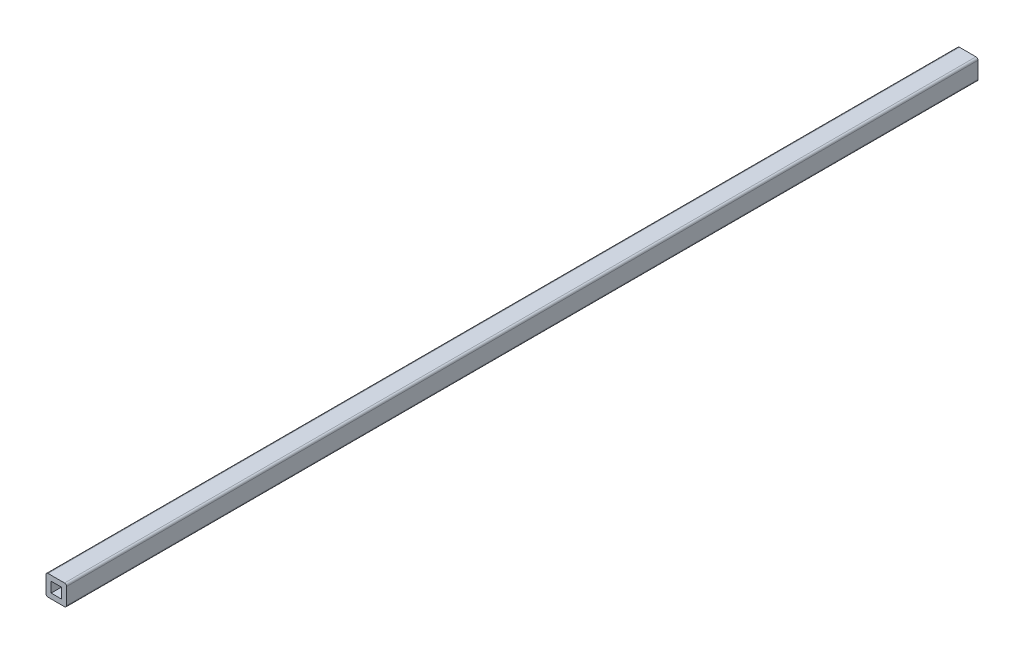
ISO-10303-21;
HEADER;
FILE_DESCRIPTION(('STEP AP214'),'2;1');
FILE_NAME('part.step','',(''),(''),'','','');
FILE_SCHEMA(('AUTOMOTIVE_DESIGN { 1 0 10303 214 1 1 1 1 }'));
ENDSEC;
DATA;
#1=APPLICATION_CONTEXT('core data for automotive mechanical design processes');
#2=APPLICATION_PROTOCOL_DEFINITION('international standard','automotive_design',2000,#1);
#3=PRODUCT_CONTEXT('',#1,'mechanical');
#4=PRODUCT('Part','Part','',(#3));
#5=PRODUCT_RELATED_PRODUCT_CATEGORY('part','',(#4));
#6=PRODUCT_DEFINITION_FORMATION('','',#4);
#7=PRODUCT_DEFINITION_CONTEXT('part definition',#1,'design');
#8=PRODUCT_DEFINITION('design','',#6,#7);
#9=PRODUCT_DEFINITION_SHAPE('','',#8);
#10=(LENGTH_UNIT() NAMED_UNIT(*) SI_UNIT(.MILLI.,.METRE.));
#11=(NAMED_UNIT(*) PLANE_ANGLE_UNIT() SI_UNIT($,.RADIAN.));
#12=(NAMED_UNIT(*) SI_UNIT($,.STERADIAN.) SOLID_ANGLE_UNIT());
#13=UNCERTAINTY_MEASURE_WITH_UNIT(LENGTH_MEASURE(1.E-05),#10,'distance_accuracy_value','');
#14=(GEOMETRIC_REPRESENTATION_CONTEXT(3) GLOBAL_UNCERTAINTY_ASSIGNED_CONTEXT((#13)) GLOBAL_UNIT_ASSIGNED_CONTEXT((#10,
#11,#12)) REPRESENTATION_CONTEXT('',''));
#15=CARTESIAN_POINT('',(0.,0.,0.));
#16=DIRECTION('',(0.,0.,1.));
#17=DIRECTION('',(1.,0.,0.));
#18=AXIS2_PLACEMENT_3D('',#15,#16,#17);
#19=CARTESIAN_POINT('',(0.,0.,2250.44));
#20=DIRECTION('',(0.,0.,1.));
#21=DIRECTION('',(1.,0.,0.));
#22=AXIS2_PLACEMENT_3D('',#19,#20,#21);
#23=PLANE('',#22);
#24=DIRECTION('',(1.,0.,0.));
#25=VECTOR('',#24,1.);
#26=CARTESIAN_POINT('',(-25.4,-25.4,2250.44));
#27=LINE('',#26,#25);
#28=CARTESIAN_POINT('',(-20.4,-25.4,2250.44));
#29=VERTEX_POINT('',#28);
#30=CARTESIAN_POINT('',(20.4,-25.4,2250.44));
#31=VERTEX_POINT('',#30);
#32=EDGE_CURVE('E173',#29,#31,#27,.T.);
#33=ORIENTED_EDGE('',*,*,#32,.T.);
#34=CARTESIAN_POINT('',(20.4,-20.4,2250.44));
#35=DIRECTION('',(0.,0.,1.));
#36=DIRECTION('',(1.,0.,0.));
#37=AXIS2_PLACEMENT_3D('',#34,#35,#36);
#38=CIRCLE('',#37,5.);
#39=CARTESIAN_POINT('',(25.4,-20.4,2250.44));
#40=VERTEX_POINT('',#39);
#41=EDGE_CURVE('E208',#31,#40,#38,.T.);
#42=ORIENTED_EDGE('',*,*,#41,.T.);
#43=DIRECTION('',(0.,1.,0.));
#44=VECTOR('',#43,1.);
#45=CARTESIAN_POINT('',(25.4,25.4,2250.44));
#46=LINE('',#45,#44);
#47=CARTESIAN_POINT('',(25.4,20.4,2250.44));
#48=VERTEX_POINT('',#47);
#49=EDGE_CURVE('E165',#40,#48,#46,.T.);
#50=ORIENTED_EDGE('',*,*,#49,.T.);
#51=CARTESIAN_POINT('',(20.4,20.4,2250.44));
#52=DIRECTION('',(0.,0.,1.));
#53=DIRECTION('',(1.,0.,0.));
#54=AXIS2_PLACEMENT_3D('',#51,#52,#53);
#55=CIRCLE('',#54,5.);
#56=CARTESIAN_POINT('',(20.4,25.4,2250.44));
#57=VERTEX_POINT('',#56);
#58=EDGE_CURVE('E203',#48,#57,#55,.T.);
#59=ORIENTED_EDGE('',*,*,#58,.T.);
#60=DIRECTION('',(-1.,0.,0.));
#61=VECTOR('',#60,1.);
#62=CARTESIAN_POINT('',(-25.4,25.4,2250.44));
#63=LINE('',#62,#61);
#64=CARTESIAN_POINT('',(-20.4,25.4,2250.44));
#65=VERTEX_POINT('',#64);
#66=EDGE_CURVE('E168',#57,#65,#63,.T.);
#67=ORIENTED_EDGE('',*,*,#66,.T.);
#68=CARTESIAN_POINT('',(-20.4,20.4,2250.44));
#69=DIRECTION('',(0.,0.,1.));
#70=DIRECTION('',(1.,0.,0.));
#71=AXIS2_PLACEMENT_3D('',#68,#69,#70);
#72=CIRCLE('',#71,5.);
#73=CARTESIAN_POINT('',(-25.4,20.4,2250.44));
#74=VERTEX_POINT('',#73);
#75=EDGE_CURVE('E55',#65,#74,#72,.T.);
#76=ORIENTED_EDGE('',*,*,#75,.T.);
#77=DIRECTION('',(0.,-1.,0.));
#78=VECTOR('',#77,1.);
#79=CARTESIAN_POINT('',(-25.4,25.4,2250.44));
#80=LINE('',#79,#78);
#81=CARTESIAN_POINT('',(-25.4,-20.4,2250.44));
#82=VERTEX_POINT('',#81);
#83=EDGE_CURVE('E171',#74,#82,#80,.T.);
#84=ORIENTED_EDGE('',*,*,#83,.T.);
#85=CARTESIAN_POINT('',(-20.4,-20.4,2250.44));
#86=DIRECTION('',(0.,0.,1.));
#87=DIRECTION('',(1.,0.,0.));
#88=AXIS2_PLACEMENT_3D('',#85,#86,#87);
#89=CIRCLE('',#88,5.);
#90=EDGE_CURVE('E206',#82,#29,#89,.T.);
#91=ORIENTED_EDGE('',*,*,#90,.T.);
#92=EDGE_LOOP('',(#33,#42,#50,#59,#67,#76,#84,#91));
#93=FACE_BOUND('',#92,.T.);
#94=DIRECTION('',(1.,0.,0.));
#95=VECTOR('',#94,1.);
#96=CARTESIAN_POINT('',(12.7,-12.7,2250.44));
#97=LINE('',#96,#95);
#98=CARTESIAN_POINT('',(-12.7,-12.7,2250.44));
#99=VERTEX_POINT('',#98);
#100=CARTESIAN_POINT('',(12.7,-12.7,2250.44));
#101=VERTEX_POINT('',#100);
#102=EDGE_CURVE('E134',#99,#101,#97,.T.);
#103=ORIENTED_EDGE('',*,*,#102,.F.);
#104=DIRECTION('',(0.,-1.,0.));
#105=VECTOR('',#104,1.);
#106=CARTESIAN_POINT('',(-12.7,-12.7,2250.44));
#107=LINE('',#106,#105);
#108=CARTESIAN_POINT('',(-12.7,12.7,2250.44));
#109=VERTEX_POINT('',#108);
#110=EDGE_CURVE('E124',#109,#99,#107,.T.);
#111=ORIENTED_EDGE('',*,*,#110,.F.);
#112=DIRECTION('',(-1.,0.,0.));
#113=VECTOR('',#112,1.);
#114=CARTESIAN_POINT('',(12.7,12.7,2250.44));
#115=LINE('',#114,#113);
#116=CARTESIAN_POINT('',(12.7,12.7,2250.44));
#117=VERTEX_POINT('',#116);
#118=EDGE_CURVE('E149',#117,#109,#115,.T.);
#119=ORIENTED_EDGE('',*,*,#118,.F.);
#120=DIRECTION('',(0.,1.,0.));
#121=VECTOR('',#120,1.);
#122=CARTESIAN_POINT('',(12.7,-12.7,2250.44));
#123=LINE('',#122,#121);
#124=EDGE_CURVE('E147',#101,#117,#123,.T.);
#125=ORIENTED_EDGE('',*,*,#124,.F.);
#126=EDGE_LOOP('',(#103,#111,#119,#125));
#127=FACE_BOUND('',#126,.T.);
#128=ADVANCED_FACE('F33',(#93,#127),#23,.T.);
#129=CARTESIAN_POINT('',(0.,0.,0.));
#130=DIRECTION('',(0.,0.,1.));
#131=DIRECTION('',(1.,0.,0.));
#132=AXIS2_PLACEMENT_3D('',#129,#130,#131);
#133=PLANE('',#132);
#134=DIRECTION('',(0.,1.,0.));
#135=VECTOR('',#134,1.);
#136=CARTESIAN_POINT('',(25.4,25.4,0.));
#137=LINE('',#136,#135);
#138=CARTESIAN_POINT('',(25.4,-20.4,0.));
#139=VERTEX_POINT('',#138);
#140=CARTESIAN_POINT('',(25.4,20.4,0.));
#141=VERTEX_POINT('',#140);
#142=EDGE_CURVE('E142',#139,#141,#137,.T.);
#143=ORIENTED_EDGE('',*,*,#142,.F.);
#144=CARTESIAN_POINT('',(20.4,-20.4,0.));
#145=DIRECTION('',(0.,0.,1.));
#146=DIRECTION('',(1.,0.,0.));
#147=AXIS2_PLACEMENT_3D('',#144,#145,#146);
#148=CIRCLE('',#147,5.);
#149=CARTESIAN_POINT('',(20.4,-25.4,0.));
#150=VERTEX_POINT('',#149);
#151=EDGE_CURVE('E196',#139,#150,#148,.F.);
#152=ORIENTED_EDGE('',*,*,#151,.T.);
#153=DIRECTION('',(1.,0.,0.));
#154=VECTOR('',#153,1.);
#155=CARTESIAN_POINT('',(-25.4,-25.4,0.));
#156=LINE('',#155,#154);
#157=CARTESIAN_POINT('',(-20.4,-25.4,0.));
#158=VERTEX_POINT('',#157);
#159=EDGE_CURVE('E169',#158,#150,#156,.T.);
#160=ORIENTED_EDGE('',*,*,#159,.F.);
#161=CARTESIAN_POINT('',(-20.4,-20.4,0.));
#162=DIRECTION('',(0.,0.,1.));
#163=DIRECTION('',(1.,0.,0.));
#164=AXIS2_PLACEMENT_3D('',#161,#162,#163);
#165=CIRCLE('',#164,5.);
#166=CARTESIAN_POINT('',(-25.4,-20.4,0.));
#167=VERTEX_POINT('',#166);
#168=EDGE_CURVE('E194',#158,#167,#165,.F.);
#169=ORIENTED_EDGE('',*,*,#168,.T.);
#170=DIRECTION('',(0.,-1.,0.));
#171=VECTOR('',#170,1.);
#172=CARTESIAN_POINT('',(-25.4,25.4,0.));
#173=LINE('',#172,#171);
#174=CARTESIAN_POINT('',(-25.4,20.4,0.));
#175=VERTEX_POINT('',#174);
#176=EDGE_CURVE('E182',#175,#167,#173,.T.);
#177=ORIENTED_EDGE('',*,*,#176,.F.);
#178=CARTESIAN_POINT('',(-20.4,20.4,0.));
#179=DIRECTION('',(0.,0.,1.));
#180=DIRECTION('',(1.,0.,0.));
#181=AXIS2_PLACEMENT_3D('',#178,#179,#180);
#182=CIRCLE('',#181,5.);
#183=CARTESIAN_POINT('',(-20.4,25.4,0.));
#184=VERTEX_POINT('',#183);
#185=EDGE_CURVE('E192',#175,#184,#182,.F.);
#186=ORIENTED_EDGE('',*,*,#185,.T.);
#187=DIRECTION('',(-1.,0.,0.));
#188=VECTOR('',#187,1.);
#189=CARTESIAN_POINT('',(-25.4,25.4,0.));
#190=LINE('',#189,#188);
#191=CARTESIAN_POINT('',(20.4,25.4,0.));
#192=VERTEX_POINT('',#191);
#193=EDGE_CURVE('E179',#192,#184,#190,.T.);
#194=ORIENTED_EDGE('',*,*,#193,.F.);
#195=CARTESIAN_POINT('',(20.4,20.4,0.));
#196=DIRECTION('',(0.,0.,1.));
#197=DIRECTION('',(1.,0.,0.));
#198=AXIS2_PLACEMENT_3D('',#195,#196,#197);
#199=CIRCLE('',#198,5.);
#200=EDGE_CURVE('E190',#192,#141,#199,.F.);
#201=ORIENTED_EDGE('',*,*,#200,.T.);
#202=EDGE_LOOP('',(#143,#152,#160,#169,#177,#186,#194,#201));
#203=FACE_BOUND('',#202,.T.);
#204=DIRECTION('',(0.,-1.,0.));
#205=VECTOR('',#204,1.);
#206=CARTESIAN_POINT('',(-12.7,-12.7,0.));
#207=LINE('',#206,#205);
#208=CARTESIAN_POINT('',(-12.7,12.7,0.));
#209=VERTEX_POINT('',#208);
#210=CARTESIAN_POINT('',(-12.7,-12.7,0.));
#211=VERTEX_POINT('',#210);
#212=EDGE_CURVE('E153',#209,#211,#207,.T.);
#213=ORIENTED_EDGE('',*,*,#212,.T.);
#214=DIRECTION('',(1.,0.,0.));
#215=VECTOR('',#214,1.);
#216=CARTESIAN_POINT('',(12.7,-12.7,0.));
#217=LINE('',#216,#215);
#218=CARTESIAN_POINT('',(12.7,-12.7,0.));
#219=VERTEX_POINT('',#218);
#220=EDGE_CURVE('E141',#211,#219,#217,.T.);
#221=ORIENTED_EDGE('',*,*,#220,.T.);
#222=DIRECTION('',(0.,1.,0.));
#223=VECTOR('',#222,1.);
#224=CARTESIAN_POINT('',(12.7,-12.7,0.));
#225=LINE('',#224,#223);
#226=CARTESIAN_POINT('',(12.7,12.7,0.));
#227=VERTEX_POINT('',#226);
#228=EDGE_CURVE('E156',#219,#227,#225,.T.);
#229=ORIENTED_EDGE('',*,*,#228,.T.);
#230=DIRECTION('',(-1.,0.,0.));
#231=VECTOR('',#230,1.);
#232=CARTESIAN_POINT('',(12.7,12.7,0.));
#233=LINE('',#232,#231);
#234=EDGE_CURVE('E135',#227,#209,#233,.T.);
#235=ORIENTED_EDGE('',*,*,#234,.T.);
#236=EDGE_LOOP('',(#213,#221,#229,#235));
#237=FACE_BOUND('',#236,.T.);
#238=ADVANCED_FACE('F224',(#203,#237),#133,.F.);
#239=CARTESIAN_POINT('',(25.4,25.4,2250.44));
#240=DIRECTION('',(-1.,0.,0.));
#241=DIRECTION('',(0.,-1.,0.));
#242=AXIS2_PLACEMENT_3D('',#239,#240,#241);
#243=PLANE('',#242);
#244=ORIENTED_EDGE('',*,*,#49,.F.);
#245=DIRECTION('',(0.,0.,-1.));
#246=VECTOR('',#245,1.);
#247=CARTESIAN_POINT('',(25.4,-20.4,2250.44));
#248=LINE('',#247,#246);
#249=EDGE_CURVE('E187',#40,#139,#248,.T.);
#250=ORIENTED_EDGE('',*,*,#249,.T.);
#251=ORIENTED_EDGE('',*,*,#142,.T.);
#252=DIRECTION('',(0.,0.,-1.));
#253=VECTOR('',#252,1.);
#254=CARTESIAN_POINT('',(25.4,20.4,2250.44));
#255=LINE('',#254,#253);
#256=EDGE_CURVE('E176',#141,#48,#255,.F.);
#257=ORIENTED_EDGE('',*,*,#256,.T.);
#258=EDGE_LOOP('',(#244,#250,#251,#257));
#259=FACE_BOUND('',#258,.T.);
#260=ADVANCED_FACE('F246',(#259),#243,.F.);
#261=CARTESIAN_POINT('',(-25.4,25.4,2250.44));
#262=DIRECTION('',(0.,-1.,0.));
#263=DIRECTION('',(1.,0.,0.));
#264=AXIS2_PLACEMENT_3D('',#261,#262,#263);
#265=PLANE('',#264);
#266=ORIENTED_EDGE('',*,*,#193,.T.);
#267=DIRECTION('',(0.,0.,-1.));
#268=VECTOR('',#267,1.);
#269=CARTESIAN_POINT('',(-20.4,25.4,2250.44));
#270=LINE('',#269,#268);
#271=EDGE_CURVE('E11',#184,#65,#270,.F.);
#272=ORIENTED_EDGE('',*,*,#271,.T.);
#273=ORIENTED_EDGE('',*,*,#66,.F.);
#274=DIRECTION('',(0.,0.,-1.));
#275=VECTOR('',#274,1.);
#276=CARTESIAN_POINT('',(20.4,25.4,2250.44));
#277=LINE('',#276,#275);
#278=EDGE_CURVE('E41',#57,#192,#277,.T.);
#279=ORIENTED_EDGE('',*,*,#278,.T.);
#280=EDGE_LOOP('',(#266,#272,#273,#279));
#281=FACE_BOUND('',#280,.T.);
#282=ADVANCED_FACE('F218',(#281),#265,.F.);
#283=CARTESIAN_POINT('',(-25.4,25.4,2250.44));
#284=DIRECTION('',(1.,0.,0.));
#285=DIRECTION('',(0.,0.,-1.));
#286=AXIS2_PLACEMENT_3D('',#283,#284,#285);
#287=PLANE('',#286);
#288=ORIENTED_EDGE('',*,*,#176,.T.);
#289=DIRECTION('',(0.,0.,-1.));
#290=VECTOR('',#289,1.);
#291=CARTESIAN_POINT('',(-25.4,-20.4,2250.44));
#292=LINE('',#291,#290);
#293=EDGE_CURVE('E48',#167,#82,#292,.F.);
#294=ORIENTED_EDGE('',*,*,#293,.T.);
#295=ORIENTED_EDGE('',*,*,#83,.F.);
#296=DIRECTION('',(0.,0.,-1.));
#297=VECTOR('',#296,1.);
#298=CARTESIAN_POINT('',(-25.4,20.4,2250.44));
#299=LINE('',#298,#297);
#300=EDGE_CURVE('E210',#74,#175,#299,.T.);
#301=ORIENTED_EDGE('',*,*,#300,.T.);
#302=EDGE_LOOP('',(#288,#294,#295,#301));
#303=FACE_BOUND('',#302,.T.);
#304=ADVANCED_FACE('F230',(#303),#287,.F.);
#305=CARTESIAN_POINT('',(-25.4,-25.4,2250.44));
#306=DIRECTION('',(0.,1.,0.));
#307=DIRECTION('',(0.,0.,1.));
#308=AXIS2_PLACEMENT_3D('',#305,#306,#307);
#309=PLANE('',#308);
#310=ORIENTED_EDGE('',*,*,#159,.T.);
#311=DIRECTION('',(0.,0.,-1.));
#312=VECTOR('',#311,1.);
#313=CARTESIAN_POINT('',(20.4,-25.4,2250.44));
#314=LINE('',#313,#312);
#315=EDGE_CURVE('E201',#150,#31,#314,.F.);
#316=ORIENTED_EDGE('',*,*,#315,.T.);
#317=ORIENTED_EDGE('',*,*,#32,.F.);
#318=DIRECTION('',(0.,0.,-1.));
#319=VECTOR('',#318,1.);
#320=CARTESIAN_POINT('',(-20.4,-25.4,2250.44));
#321=LINE('',#320,#319);
#322=EDGE_CURVE('E198',#29,#158,#321,.T.);
#323=ORIENTED_EDGE('',*,*,#322,.T.);
#324=EDGE_LOOP('',(#310,#316,#317,#323));
#325=FACE_BOUND('',#324,.T.);
#326=ADVANCED_FACE('F238',(#325),#309,.F.);
#327=CARTESIAN_POINT('',(-12.7,-12.7,2250.44));
#328=DIRECTION('',(1.,0.,0.));
#329=DIRECTION('',(0.,0.,-1.));
#330=AXIS2_PLACEMENT_3D('',#327,#328,#329);
#331=PLANE('',#330);
#332=ORIENTED_EDGE('',*,*,#212,.F.);
#333=DIRECTION('',(0.,0.,-1.));
#334=VECTOR('',#333,1.);
#335=CARTESIAN_POINT('',(-12.7,12.7,2250.44));
#336=LINE('',#335,#334);
#337=EDGE_CURVE('E130',#109,#209,#336,.T.);
#338=ORIENTED_EDGE('',*,*,#337,.F.);
#339=ORIENTED_EDGE('',*,*,#110,.T.);
#340=DIRECTION('',(0.,0.,-1.));
#341=VECTOR('',#340,1.);
#342=CARTESIAN_POINT('',(-12.7,-12.7,2250.44));
#343=LINE('',#342,#341);
#344=EDGE_CURVE('E127',#99,#211,#343,.T.);
#345=ORIENTED_EDGE('',*,*,#344,.T.);
#346=EDGE_LOOP('',(#332,#338,#339,#345));
#347=FACE_BOUND('',#346,.T.);
#348=ADVANCED_FACE('F126',(#347),#331,.T.);
#349=CARTESIAN_POINT('',(12.7,-12.7,2250.44));
#350=DIRECTION('',(0.,1.,0.));
#351=DIRECTION('',(0.,0.,1.));
#352=AXIS2_PLACEMENT_3D('',#349,#350,#351);
#353=PLANE('',#352);
#354=ORIENTED_EDGE('',*,*,#220,.F.);
#355=ORIENTED_EDGE('',*,*,#344,.F.);
#356=ORIENTED_EDGE('',*,*,#102,.T.);
#357=DIRECTION('',(0.,0.,-1.));
#358=VECTOR('',#357,1.);
#359=CARTESIAN_POINT('',(12.7,-12.7,2250.44));
#360=LINE('',#359,#358);
#361=EDGE_CURVE('E143',#101,#219,#360,.T.);
#362=ORIENTED_EDGE('',*,*,#361,.T.);
#363=EDGE_LOOP('',(#354,#355,#356,#362));
#364=FACE_BOUND('',#363,.T.);
#365=ADVANCED_FACE('F138',(#364),#353,.T.);
#366=CARTESIAN_POINT('',(12.7,-12.7,2250.44));
#367=DIRECTION('',(-1.,0.,0.));
#368=DIRECTION('',(0.,0.,1.));
#369=AXIS2_PLACEMENT_3D('',#366,#367,#368);
#370=PLANE('',#369);
#371=ORIENTED_EDGE('',*,*,#228,.F.);
#372=ORIENTED_EDGE('',*,*,#361,.F.);
#373=ORIENTED_EDGE('',*,*,#124,.T.);
#374=DIRECTION('',(0.,0.,-1.));
#375=VECTOR('',#374,1.);
#376=CARTESIAN_POINT('',(12.7,12.7,2250.44));
#377=LINE('',#376,#375);
#378=EDGE_CURVE('E162',#117,#227,#377,.T.);
#379=ORIENTED_EDGE('',*,*,#378,.T.);
#380=EDGE_LOOP('',(#371,#372,#373,#379));
#381=FACE_BOUND('',#380,.T.);
#382=ADVANCED_FACE('F302',(#381),#370,.T.);
#383=CARTESIAN_POINT('',(12.7,12.7,2250.44));
#384=DIRECTION('',(0.,-1.,0.));
#385=DIRECTION('',(0.,0.,-1.));
#386=AXIS2_PLACEMENT_3D('',#383,#384,#385);
#387=PLANE('',#386);
#388=ORIENTED_EDGE('',*,*,#234,.F.);
#389=ORIENTED_EDGE('',*,*,#378,.F.);
#390=ORIENTED_EDGE('',*,*,#118,.T.);
#391=ORIENTED_EDGE('',*,*,#337,.T.);
#392=EDGE_LOOP('',(#388,#389,#390,#391));
#393=FACE_BOUND('',#392,.T.);
#394=ADVANCED_FACE('F271',(#393),#387,.T.);
#395=CARTESIAN_POINT('',(20.4,-20.4,2250.44));
#396=DIRECTION('',(0.,0.,-1.));
#397=DIRECTION('',(-1.,0.,0.));
#398=AXIS2_PLACEMENT_3D('',#395,#396,#397);
#399=CYLINDRICAL_SURFACE('',#398,5.);
#400=ORIENTED_EDGE('',*,*,#41,.F.);
#401=ORIENTED_EDGE('',*,*,#315,.F.);
#402=ORIENTED_EDGE('',*,*,#151,.F.);
#403=ORIENTED_EDGE('',*,*,#249,.F.);
#404=EDGE_LOOP('',(#400,#401,#402,#403));
#405=FACE_BOUND('',#404,.T.);
#406=ADVANCED_FACE('F243',(#405),#399,.T.);
#407=CARTESIAN_POINT('',(-20.4,-20.4,2250.44));
#408=DIRECTION('',(0.,0.,-1.));
#409=DIRECTION('',(-1.,0.,0.));
#410=AXIS2_PLACEMENT_3D('',#407,#408,#409);
#411=CYLINDRICAL_SURFACE('',#410,5.);
#412=ORIENTED_EDGE('',*,*,#90,.F.);
#413=ORIENTED_EDGE('',*,*,#293,.F.);
#414=ORIENTED_EDGE('',*,*,#168,.F.);
#415=ORIENTED_EDGE('',*,*,#322,.F.);
#416=EDGE_LOOP('',(#412,#413,#414,#415));
#417=FACE_BOUND('',#416,.T.);
#418=ADVANCED_FACE('F235',(#417),#411,.T.);
#419=CARTESIAN_POINT('',(-20.4,20.4,2250.44));
#420=DIRECTION('',(0.,0.,-1.));
#421=DIRECTION('',(-1.,0.,0.));
#422=AXIS2_PLACEMENT_3D('',#419,#420,#421);
#423=CYLINDRICAL_SURFACE('',#422,5.);
#424=ORIENTED_EDGE('',*,*,#75,.F.);
#425=ORIENTED_EDGE('',*,*,#271,.F.);
#426=ORIENTED_EDGE('',*,*,#185,.F.);
#427=ORIENTED_EDGE('',*,*,#300,.F.);
#428=EDGE_LOOP('',(#424,#425,#426,#427));
#429=FACE_BOUND('',#428,.T.);
#430=ADVANCED_FACE('F229',(#429),#423,.T.);
#431=CARTESIAN_POINT('',(20.4,20.4,2250.44));
#432=DIRECTION('',(0.,0.,-1.));
#433=DIRECTION('',(-1.,0.,0.));
#434=AXIS2_PLACEMENT_3D('',#431,#432,#433);
#435=CYLINDRICAL_SURFACE('',#434,5.);
#436=ORIENTED_EDGE('',*,*,#58,.F.);
#437=ORIENTED_EDGE('',*,*,#256,.F.);
#438=ORIENTED_EDGE('',*,*,#200,.F.);
#439=ORIENTED_EDGE('',*,*,#278,.F.);
#440=EDGE_LOOP('',(#436,#437,#438,#439));
#441=FACE_BOUND('',#440,.T.);
#442=ADVANCED_FACE('F35',(#441),#435,.T.);
#443=CLOSED_SHELL('',(#128,#238,#260,#282,#304,#326,#348,#365,#382,#394,#406,#418,#430,#442));
#444=MANIFOLD_SOLID_BREP('B2',#443);
#445=ADVANCED_BREP_SHAPE_REPRESENTATION('',(#18,#444),#14);
#446=SHAPE_DEFINITION_REPRESENTATION(#9,#445);
ENDSEC;
END-ISO-10303-21;
